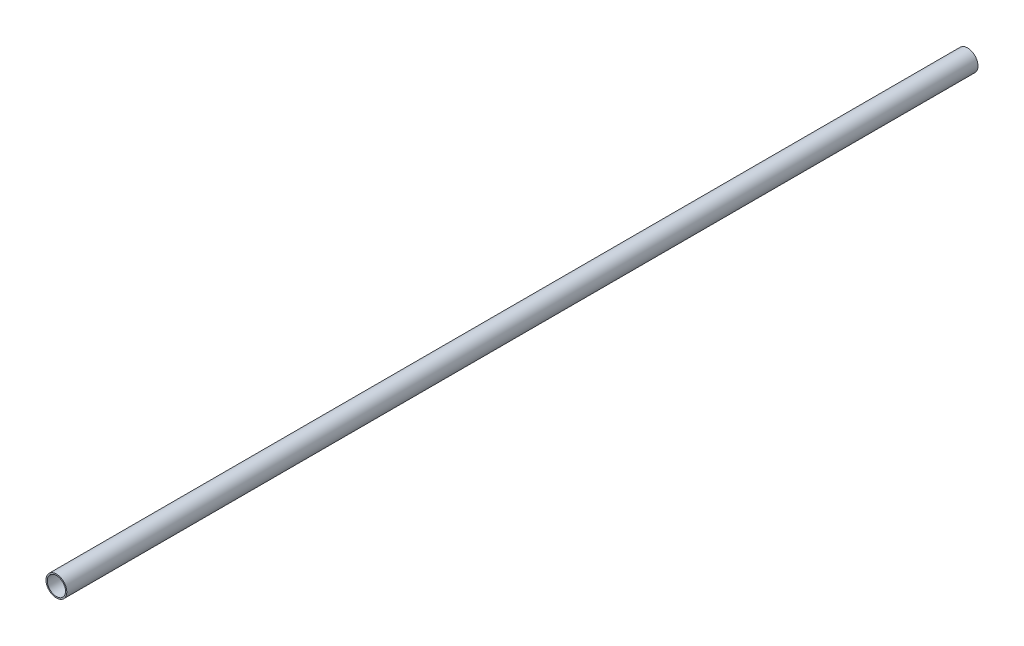
ISO-10303-21;
HEADER;
FILE_DESCRIPTION(('STEP AP214'),'2;1');
FILE_NAME('part.step','',(''),(''),'','','');
FILE_SCHEMA(('AUTOMOTIVE_DESIGN { 1 0 10303 214 1 1 1 1 }'));
ENDSEC;
DATA;
#1=APPLICATION_CONTEXT('core data for automotive mechanical design processes');
#2=APPLICATION_PROTOCOL_DEFINITION('international standard','automotive_design',2000,#1);
#3=PRODUCT_CONTEXT('',#1,'mechanical');
#4=PRODUCT('Part','Part','',(#3));
#5=PRODUCT_RELATED_PRODUCT_CATEGORY('part','',(#4));
#6=PRODUCT_DEFINITION_FORMATION('','',#4);
#7=PRODUCT_DEFINITION_CONTEXT('part definition',#1,'design');
#8=PRODUCT_DEFINITION('design','',#6,#7);
#9=PRODUCT_DEFINITION_SHAPE('','',#8);
#10=(LENGTH_UNIT() NAMED_UNIT(*) SI_UNIT(.MILLI.,.METRE.));
#11=(NAMED_UNIT(*) PLANE_ANGLE_UNIT() SI_UNIT($,.RADIAN.));
#12=(NAMED_UNIT(*) SI_UNIT($,.STERADIAN.) SOLID_ANGLE_UNIT());
#13=UNCERTAINTY_MEASURE_WITH_UNIT(LENGTH_MEASURE(1.E-05),#10,'distance_accuracy_value','');
#14=(GEOMETRIC_REPRESENTATION_CONTEXT(3) GLOBAL_UNCERTAINTY_ASSIGNED_CONTEXT((#13)) GLOBAL_UNIT_ASSIGNED_CONTEXT((#10,
#11,#12)) REPRESENTATION_CONTEXT('',''));
#15=CARTESIAN_POINT('',(0.,0.,0.));
#16=DIRECTION('',(0.,0.,1.));
#17=DIRECTION('',(1.,0.,0.));
#18=AXIS2_PLACEMENT_3D('',#15,#16,#17);
#19=CARTESIAN_POINT('',(0.,0.,350.));
#20=DIRECTION('',(0.,0.,1.));
#21=DIRECTION('',(1.,0.,0.));
#22=AXIS2_PLACEMENT_3D('',#19,#20,#21);
#23=PLANE('',#22);
#24=CARTESIAN_POINT('',(0.,0.,350.));
#25=DIRECTION('',(0.,0.,1.));
#26=DIRECTION('',(1.,0.,0.));
#27=AXIS2_PLACEMENT_3D('',#24,#25,#26);
#28=CIRCLE('',#27,8.);
#29=CARTESIAN_POINT('',(8.,0.,350.));
#30=VERTEX_POINT('',#29);
#31=EDGE_CURVE('E10',#30,#30,#28,.T.);
#32=ORIENTED_EDGE('',*,*,#31,.T.);
#33=EDGE_LOOP('',(#32));
#34=FACE_BOUND('',#33,.T.);
#35=CARTESIAN_POINT('',(0.,0.,350.));
#36=DIRECTION('',(0.,0.,1.));
#37=DIRECTION('',(1.,0.,0.));
#38=AXIS2_PLACEMENT_3D('',#35,#36,#37);
#39=CIRCLE('',#38,7.);
#40=CARTESIAN_POINT('',(7.,0.,350.));
#41=VERTEX_POINT('',#40);
#42=EDGE_CURVE('E44',#41,#41,#39,.T.);
#43=ORIENTED_EDGE('',*,*,#42,.F.);
#44=EDGE_LOOP('',(#43));
#45=FACE_BOUND('',#44,.T.);
#46=ADVANCED_FACE('F33',(#34,#45),#23,.T.);
#47=CARTESIAN_POINT('',(0.,0.,-350.));
#48=DIRECTION('',(0.,0.,1.));
#49=DIRECTION('',(1.,0.,0.));
#50=AXIS2_PLACEMENT_3D('',#47,#48,#49);
#51=PLANE('',#50);
#52=CARTESIAN_POINT('',(0.,0.,-350.));
#53=DIRECTION('',(0.,0.,1.));
#54=DIRECTION('',(1.,0.,0.));
#55=AXIS2_PLACEMENT_3D('',#52,#53,#54);
#56=CIRCLE('',#55,8.);
#57=CARTESIAN_POINT('',(8.,0.,-350.));
#58=VERTEX_POINT('',#57);
#59=EDGE_CURVE('E37',#58,#58,#56,.T.);
#60=ORIENTED_EDGE('',*,*,#59,.F.);
#61=EDGE_LOOP('',(#60));
#62=FACE_BOUND('',#61,.T.);
#63=CARTESIAN_POINT('',(0.,0.,-350.));
#64=DIRECTION('',(0.,0.,1.));
#65=DIRECTION('',(1.,0.,0.));
#66=AXIS2_PLACEMENT_3D('',#63,#64,#65);
#67=CIRCLE('',#66,7.);
#68=CARTESIAN_POINT('',(7.,0.,-350.));
#69=VERTEX_POINT('',#68);
#70=EDGE_CURVE('E46',#69,#69,#67,.T.);
#71=ORIENTED_EDGE('',*,*,#70,.T.);
#72=EDGE_LOOP('',(#71));
#73=FACE_BOUND('',#72,.T.);
#74=ADVANCED_FACE('F56',(#62,#73),#51,.F.);
#75=CARTESIAN_POINT('',(0.,0.,350.));
#76=DIRECTION('',(0.,0.,-1.));
#77=DIRECTION('',(-1.,0.,0.));
#78=AXIS2_PLACEMENT_3D('',#75,#76,#77);
#79=CYLINDRICAL_SURFACE('',#78,8.);
#80=ORIENTED_EDGE('',*,*,#31,.F.);
#81=EDGE_LOOP('',(#80));
#82=FACE_BOUND('',#81,.T.);
#83=ORIENTED_EDGE('',*,*,#59,.T.);
#84=EDGE_LOOP('',(#83));
#85=FACE_BOUND('',#84,.T.);
#86=ADVANCED_FACE('F35',(#82,#85),#79,.T.);
#87=CARTESIAN_POINT('',(0.,0.,350.));
#88=DIRECTION('',(0.,0.,-1.));
#89=DIRECTION('',(-1.,0.,0.));
#90=AXIS2_PLACEMENT_3D('',#87,#88,#89);
#91=CYLINDRICAL_SURFACE('',#90,7.);
#92=ORIENTED_EDGE('',*,*,#42,.T.);
#93=EDGE_LOOP('',(#92));
#94=FACE_BOUND('',#93,.T.);
#95=ORIENTED_EDGE('',*,*,#70,.F.);
#96=EDGE_LOOP('',(#95));
#97=FACE_BOUND('',#96,.T.);
#98=ADVANCED_FACE('F52',(#94,#97),#91,.F.);
#99=CLOSED_SHELL('',(#46,#74,#86,#98));
#100=MANIFOLD_SOLID_BREP('B2',#99);
#101=ADVANCED_BREP_SHAPE_REPRESENTATION('',(#18,#100),#14);
#102=SHAPE_DEFINITION_REPRESENTATION(#9,#101);
ENDSEC;
END-ISO-10303-21;
